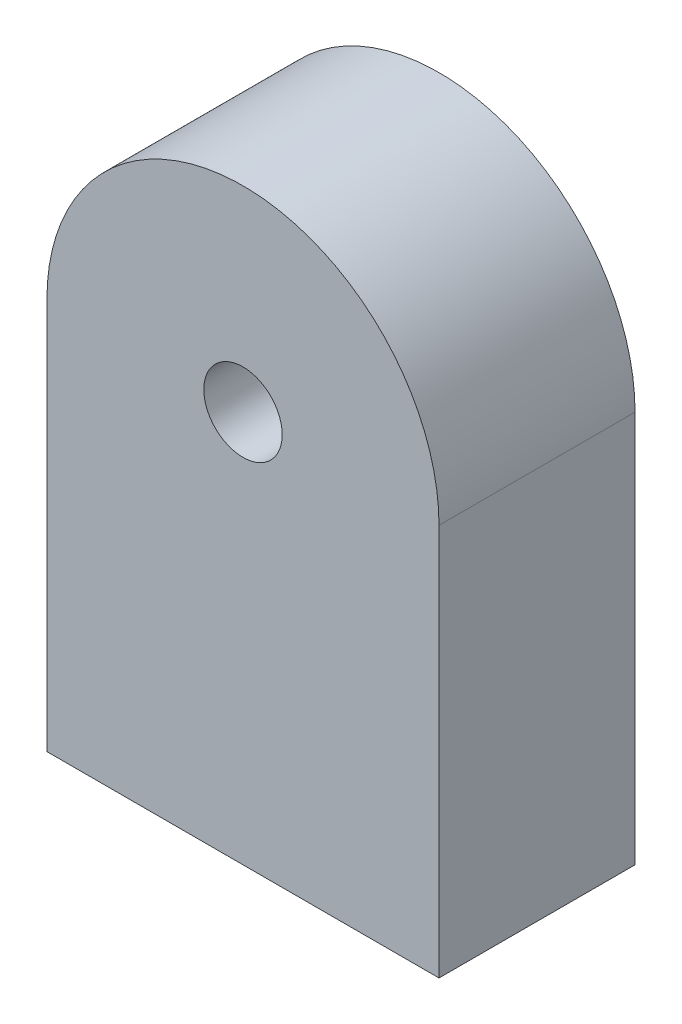
ISO-10303-21;
HEADER;
FILE_DESCRIPTION(('STEP AP214'),'2;1');
FILE_NAME('part.step','',(''),(''),'','','');
FILE_SCHEMA(('AUTOMOTIVE_DESIGN { 1 0 10303 214 1 1 1 1 }'));
ENDSEC;
DATA;
#1=APPLICATION_CONTEXT('core data for automotive mechanical design processes');
#2=APPLICATION_PROTOCOL_DEFINITION('international standard','automotive_design',2000,#1);
#3=PRODUCT_CONTEXT('',#1,'mechanical');
#4=PRODUCT('Part','Part','',(#3));
#5=PRODUCT_RELATED_PRODUCT_CATEGORY('part','',(#4));
#6=PRODUCT_DEFINITION_FORMATION('','',#4);
#7=PRODUCT_DEFINITION_CONTEXT('part definition',#1,'design');
#8=PRODUCT_DEFINITION('design','',#6,#7);
#9=PRODUCT_DEFINITION_SHAPE('','',#8);
#10=(LENGTH_UNIT() NAMED_UNIT(*) SI_UNIT(.MILLI.,.METRE.));
#11=(NAMED_UNIT(*) PLANE_ANGLE_UNIT() SI_UNIT($,.RADIAN.));
#12=(NAMED_UNIT(*) SI_UNIT($,.STERADIAN.) SOLID_ANGLE_UNIT());
#13=UNCERTAINTY_MEASURE_WITH_UNIT(LENGTH_MEASURE(1.E-05),#10,'distance_accuracy_value','');
#14=(GEOMETRIC_REPRESENTATION_CONTEXT(3) GLOBAL_UNCERTAINTY_ASSIGNED_CONTEXT((#13)) GLOBAL_UNIT_ASSIGNED_CONTEXT((#10,
#11,#12)) REPRESENTATION_CONTEXT('',''));
#15=CARTESIAN_POINT('',(0.,0.,0.));
#16=DIRECTION('',(0.,0.,1.));
#17=DIRECTION('',(1.,0.,0.));
#18=AXIS2_PLACEMENT_3D('',#15,#16,#17);
#19=CARTESIAN_POINT('',(0.,0.,7.5));
#20=DIRECTION('',(-1.,0.,0.));
#21=DIRECTION('',(0.,0.,1.));
#22=AXIS2_PLACEMENT_3D('',#19,#20,#21);
#23=PLANE('',#22);
#24=DIRECTION('',(0.,1.,0.));
#25=VECTOR('',#24,1.);
#26=CARTESIAN_POINT('',(0.,0.,-7.5));
#27=LINE('',#26,#25);
#28=CARTESIAN_POINT('',(0.,0.,-7.5));
#29=VERTEX_POINT('',#28);
#30=CARTESIAN_POINT('',(0.,30.,-7.5));
#31=VERTEX_POINT('',#30);
#32=EDGE_CURVE('E114',#29,#31,#27,.T.);
#33=ORIENTED_EDGE('',*,*,#32,.T.);
#34=DIRECTION('',(0.,0.,-1.));
#35=VECTOR('',#34,1.);
#36=CARTESIAN_POINT('',(0.,30.,7.5));
#37=LINE('',#36,#35);
#38=CARTESIAN_POINT('',(0.,30.,7.5));
#39=VERTEX_POINT('',#38);
#40=EDGE_CURVE('E11',#39,#31,#37,.T.);
#41=ORIENTED_EDGE('',*,*,#40,.F.);
#42=DIRECTION('',(0.,1.,0.));
#43=VECTOR('',#42,1.);
#44=CARTESIAN_POINT('',(0.,0.,7.5));
#45=LINE('',#44,#43);
#46=CARTESIAN_POINT('',(0.,0.,7.5));
#47=VERTEX_POINT('',#46);
#48=EDGE_CURVE('E100',#47,#39,#45,.T.);
#49=ORIENTED_EDGE('',*,*,#48,.F.);
#50=DIRECTION('',(0.,0.,-1.));
#51=VECTOR('',#50,1.);
#52=CARTESIAN_POINT('',(0.,0.,7.5));
#53=LINE('',#52,#51);
#54=EDGE_CURVE('E108',#47,#29,#53,.T.);
#55=ORIENTED_EDGE('',*,*,#54,.T.);
#56=EDGE_LOOP('',(#33,#41,#49,#55));
#57=FACE_BOUND('',#56,.T.);
#58=ADVANCED_FACE('F44',(#57),#23,.F.);
#59=CARTESIAN_POINT('',(-15.,30.,7.5));
#60=DIRECTION('',(0.,0.,-1.));
#61=DIRECTION('',(-1.,0.,0.));
#62=AXIS2_PLACEMENT_3D('',#59,#60,#61);
#63=CYLINDRICAL_SURFACE('',#62,15.);
#64=CARTESIAN_POINT('',(-15.,30.,-7.5));
#65=DIRECTION('',(0.,0.,1.));
#66=DIRECTION('',(1.,0.,0.));
#67=AXIS2_PLACEMENT_3D('',#64,#65,#66);
#68=CIRCLE('',#67,15.);
#69=CARTESIAN_POINT('',(-30.,30.,-7.5));
#70=VERTEX_POINT('',#69);
#71=EDGE_CURVE('E105',#31,#70,#68,.T.);
#72=ORIENTED_EDGE('',*,*,#71,.T.);
#73=DIRECTION('',(0.,0.,-1.));
#74=VECTOR('',#73,1.);
#75=CARTESIAN_POINT('',(-30.,30.,7.5));
#76=LINE('',#75,#74);
#77=CARTESIAN_POINT('',(-30.,30.,7.5));
#78=VERTEX_POINT('',#77);
#79=EDGE_CURVE('E53',#78,#70,#76,.T.);
#80=ORIENTED_EDGE('',*,*,#79,.F.);
#81=CARTESIAN_POINT('',(-15.,30.,7.5));
#82=DIRECTION('',(0.,0.,1.));
#83=DIRECTION('',(1.,0.,0.));
#84=AXIS2_PLACEMENT_3D('',#81,#82,#83);
#85=CIRCLE('',#84,15.);
#86=EDGE_CURVE('E95',#39,#78,#85,.T.);
#87=ORIENTED_EDGE('',*,*,#86,.F.);
#88=ORIENTED_EDGE('',*,*,#40,.T.);
#89=EDGE_LOOP('',(#72,#80,#87,#88));
#90=FACE_BOUND('',#89,.T.);
#91=ADVANCED_FACE('F101',(#90),#63,.T.);
#92=CARTESIAN_POINT('',(-30.,0.,7.5));
#93=DIRECTION('',(1.,0.,0.));
#94=DIRECTION('',(0.,0.,-1.));
#95=AXIS2_PLACEMENT_3D('',#92,#93,#94);
#96=PLANE('',#95);
#97=DIRECTION('',(0.,-1.,0.));
#98=VECTOR('',#97,1.);
#99=CARTESIAN_POINT('',(-30.,0.,-7.5));
#100=LINE('',#99,#98);
#101=CARTESIAN_POINT('',(-30.,0.,-7.5));
#102=VERTEX_POINT('',#101);
#103=EDGE_CURVE('E78',#70,#102,#100,.T.);
#104=ORIENTED_EDGE('',*,*,#103,.T.);
#105=DIRECTION('',(0.,0.,-1.));
#106=VECTOR('',#105,1.);
#107=CARTESIAN_POINT('',(-30.,0.,7.5));
#108=LINE('',#107,#106);
#109=CARTESIAN_POINT('',(-30.,0.,7.5));
#110=VERTEX_POINT('',#109);
#111=EDGE_CURVE('E102',#110,#102,#108,.T.);
#112=ORIENTED_EDGE('',*,*,#111,.F.);
#113=DIRECTION('',(0.,-1.,0.));
#114=VECTOR('',#113,1.);
#115=CARTESIAN_POINT('',(-30.,0.,7.5));
#116=LINE('',#115,#114);
#117=EDGE_CURVE('E92',#78,#110,#116,.T.);
#118=ORIENTED_EDGE('',*,*,#117,.F.);
#119=ORIENTED_EDGE('',*,*,#79,.T.);
#120=EDGE_LOOP('',(#104,#112,#118,#119));
#121=FACE_BOUND('',#120,.T.);
#122=ADVANCED_FACE('F104',(#121),#96,.F.);
#123=CARTESIAN_POINT('',(0.,0.,7.5));
#124=DIRECTION('',(0.,1.,0.));
#125=DIRECTION('',(0.,0.,1.));
#126=AXIS2_PLACEMENT_3D('',#123,#124,#125);
#127=PLANE('',#126);
#128=DIRECTION('',(1.,0.,0.));
#129=VECTOR('',#128,1.);
#130=CARTESIAN_POINT('',(0.,0.,-7.5));
#131=LINE('',#130,#129);
#132=EDGE_CURVE('E83',#102,#29,#131,.T.);
#133=ORIENTED_EDGE('',*,*,#132,.T.);
#134=ORIENTED_EDGE('',*,*,#54,.F.);
#135=DIRECTION('',(1.,0.,0.));
#136=VECTOR('',#135,1.);
#137=CARTESIAN_POINT('',(0.,0.,7.5));
#138=LINE('',#137,#136);
#139=EDGE_CURVE('E61',#110,#47,#138,.T.);
#140=ORIENTED_EDGE('',*,*,#139,.F.);
#141=ORIENTED_EDGE('',*,*,#111,.T.);
#142=EDGE_LOOP('',(#133,#134,#140,#141));
#143=FACE_BOUND('',#142,.T.);
#144=ADVANCED_FACE('F130',(#143),#127,.F.);
#145=CARTESIAN_POINT('',(-15.,30.,7.5));
#146=DIRECTION('',(0.,0.,1.));
#147=DIRECTION('',(1.,0.,0.));
#148=AXIS2_PLACEMENT_3D('',#145,#146,#147);
#149=PLANE('',#148);
#150=CARTESIAN_POINT('',(-15.,30.,7.5));
#151=DIRECTION('',(0.,0.,1.));
#152=DIRECTION('',(1.,0.,0.));
#153=AXIS2_PLACEMENT_3D('',#150,#151,#152);
#154=CIRCLE('',#153,3.);
#155=CARTESIAN_POINT('',(-12.,30.,7.5));
#156=VERTEX_POINT('',#155);
#157=EDGE_CURVE('E133',#156,#156,#154,.T.);
#158=ORIENTED_EDGE('',*,*,#157,.F.);
#159=EDGE_LOOP('',(#158));
#160=FACE_BOUND('',#159,.T.);
#161=ORIENTED_EDGE('',*,*,#48,.T.);
#162=ORIENTED_EDGE('',*,*,#86,.T.);
#163=ORIENTED_EDGE('',*,*,#117,.T.);
#164=ORIENTED_EDGE('',*,*,#139,.T.);
#165=EDGE_LOOP('',(#161,#162,#163,#164));
#166=FACE_BOUND('',#165,.T.);
#167=ADVANCED_FACE('F91',(#160,#166),#149,.T.);
#168=CARTESIAN_POINT('',(-15.,30.,-7.5));
#169=DIRECTION('',(0.,0.,1.));
#170=DIRECTION('',(1.,0.,0.));
#171=AXIS2_PLACEMENT_3D('',#168,#169,#170);
#172=PLANE('',#171);
#173=CARTESIAN_POINT('',(-15.,30.,-7.5));
#174=DIRECTION('',(0.,0.,1.));
#175=DIRECTION('',(1.,0.,0.));
#176=AXIS2_PLACEMENT_3D('',#173,#174,#175);
#177=CIRCLE('',#176,3.);
#178=CARTESIAN_POINT('',(-12.,30.,-7.5));
#179=VERTEX_POINT('',#178);
#180=EDGE_CURVE('E116',#179,#179,#177,.T.);
#181=ORIENTED_EDGE('',*,*,#180,.T.);
#182=EDGE_LOOP('',(#181));
#183=FACE_BOUND('',#182,.T.);
#184=ORIENTED_EDGE('',*,*,#32,.F.);
#185=ORIENTED_EDGE('',*,*,#132,.F.);
#186=ORIENTED_EDGE('',*,*,#103,.F.);
#187=ORIENTED_EDGE('',*,*,#71,.F.);
#188=EDGE_LOOP('',(#184,#185,#186,#187));
#189=FACE_BOUND('',#188,.T.);
#190=ADVANCED_FACE('F128',(#183,#189),#172,.F.);
#191=CARTESIAN_POINT('',(-15.,30.,-7.5));
#192=DIRECTION('',(0.,0.,1.));
#193=DIRECTION('',(1.,0.,0.));
#194=AXIS2_PLACEMENT_3D('',#191,#192,#193);
#195=CYLINDRICAL_SURFACE('',#194,3.);
#196=ORIENTED_EDGE('',*,*,#180,.F.);
#197=EDGE_LOOP('',(#196));
#198=FACE_BOUND('',#197,.T.);
#199=ORIENTED_EDGE('',*,*,#157,.T.);
#200=EDGE_LOOP('',(#199));
#201=FACE_BOUND('',#200,.T.);
#202=ADVANCED_FACE('F141',(#198,#201),#195,.F.);
#203=CLOSED_SHELL('',(#58,#91,#122,#144,#167,#190,#202));
#204=MANIFOLD_SOLID_BREP('B2',#203);
#205=ADVANCED_BREP_SHAPE_REPRESENTATION('',(#18,#204),#14);
#206=SHAPE_DEFINITION_REPRESENTATION(#9,#205);
ENDSEC;
END-ISO-10303-21;
